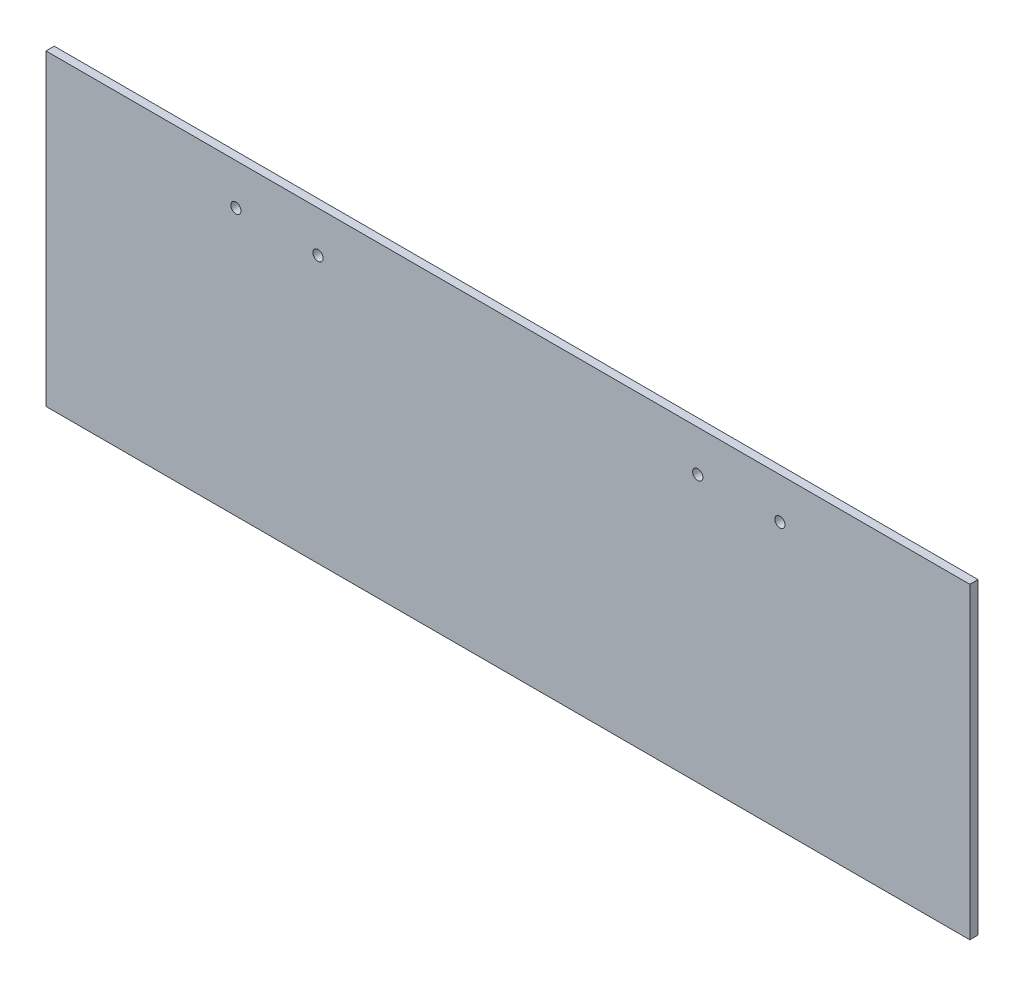
ISO-10303-21;
HEADER;
FILE_DESCRIPTION(('STEP AP214'),'2;1');
FILE_NAME('part.step','',(''),(''),'','','');
FILE_SCHEMA(('AUTOMOTIVE_DESIGN { 1 0 10303 214 1 1 1 1 }'));
ENDSEC;
DATA;
#1=APPLICATION_CONTEXT('core data for automotive mechanical design processes');
#2=APPLICATION_PROTOCOL_DEFINITION('international standard','automotive_design',2000,#1);
#3=PRODUCT_CONTEXT('',#1,'mechanical');
#4=PRODUCT('Part','Part','',(#3));
#5=PRODUCT_RELATED_PRODUCT_CATEGORY('part','',(#4));
#6=PRODUCT_DEFINITION_FORMATION('','',#4);
#7=PRODUCT_DEFINITION_CONTEXT('part definition',#1,'design');
#8=PRODUCT_DEFINITION('design','',#6,#7);
#9=PRODUCT_DEFINITION_SHAPE('','',#8);
#10=(LENGTH_UNIT() NAMED_UNIT(*) SI_UNIT(.MILLI.,.METRE.));
#11=(NAMED_UNIT(*) PLANE_ANGLE_UNIT() SI_UNIT($,.RADIAN.));
#12=(NAMED_UNIT(*) SI_UNIT($,.STERADIAN.) SOLID_ANGLE_UNIT());
#13=UNCERTAINTY_MEASURE_WITH_UNIT(LENGTH_MEASURE(1.E-05),#10,'distance_accuracy_value','');
#14=(GEOMETRIC_REPRESENTATION_CONTEXT(3) GLOBAL_UNCERTAINTY_ASSIGNED_CONTEXT((#13)) GLOBAL_UNIT_ASSIGNED_CONTEXT((#10,
#11,#12)) REPRESENTATION_CONTEXT('',''));
#15=CARTESIAN_POINT('',(0.,0.,0.));
#16=DIRECTION('',(0.,0.,1.));
#17=DIRECTION('',(1.,0.,0.));
#18=AXIS2_PLACEMENT_3D('',#15,#16,#17);
#19=CARTESIAN_POINT('',(-225.,150.,2.));
#20=DIRECTION('',(1.,0.,0.));
#21=DIRECTION('',(0.,1.,0.));
#22=AXIS2_PLACEMENT_3D('',#19,#20,#21);
#23=PLANE('',#22);
#24=DIRECTION('',(0.,-1.,0.));
#25=VECTOR('',#24,1.);
#26=CARTESIAN_POINT('',(-225.,150.,-2.));
#27=LINE('',#26,#25);
#28=CARTESIAN_POINT('',(-225.,150.,-2.));
#29=VERTEX_POINT('',#28);
#30=CARTESIAN_POINT('',(-225.,0.,-2.));
#31=VERTEX_POINT('',#30);
#32=EDGE_CURVE('E105',#29,#31,#27,.T.);
#33=ORIENTED_EDGE('',*,*,#32,.T.);
#34=DIRECTION('',(0.,0.,-1.));
#35=VECTOR('',#34,1.);
#36=CARTESIAN_POINT('',(-225.,0.,2.));
#37=LINE('',#36,#35);
#38=CARTESIAN_POINT('',(-225.,0.,2.));
#39=VERTEX_POINT('',#38);
#40=EDGE_CURVE('E11',#39,#31,#37,.T.);
#41=ORIENTED_EDGE('',*,*,#40,.F.);
#42=DIRECTION('',(0.,-1.,0.));
#43=VECTOR('',#42,1.);
#44=CARTESIAN_POINT('',(-225.,150.,2.));
#45=LINE('',#44,#43);
#46=CARTESIAN_POINT('',(-225.,150.,2.));
#47=VERTEX_POINT('',#46);
#48=EDGE_CURVE('E89',#47,#39,#45,.T.);
#49=ORIENTED_EDGE('',*,*,#48,.F.);
#50=DIRECTION('',(0.,0.,-1.));
#51=VECTOR('',#50,1.);
#52=CARTESIAN_POINT('',(-225.,150.,2.));
#53=LINE('',#52,#51);
#54=EDGE_CURVE('E98',#47,#29,#53,.T.);
#55=ORIENTED_EDGE('',*,*,#54,.T.);
#56=EDGE_LOOP('',(#33,#41,#49,#55));
#57=FACE_BOUND('',#56,.T.);
#58=ADVANCED_FACE('F39',(#57),#23,.F.);
#59=CARTESIAN_POINT('',(225.,0.,2.));
#60=DIRECTION('',(0.,1.,0.));
#61=DIRECTION('',(-1.,0.,0.));
#62=AXIS2_PLACEMENT_3D('',#59,#60,#61);
#63=PLANE('',#62);
#64=DIRECTION('',(1.,0.,0.));
#65=VECTOR('',#64,1.);
#66=CARTESIAN_POINT('',(225.,0.,-2.));
#67=LINE('',#66,#65);
#68=CARTESIAN_POINT('',(225.,0.,-2.));
#69=VERTEX_POINT('',#68);
#70=EDGE_CURVE('E94',#31,#69,#67,.T.);
#71=ORIENTED_EDGE('',*,*,#70,.T.);
#72=DIRECTION('',(0.,0.,-1.));
#73=VECTOR('',#72,1.);
#74=CARTESIAN_POINT('',(225.,0.,2.));
#75=LINE('',#74,#73);
#76=CARTESIAN_POINT('',(225.,0.,2.));
#77=VERTEX_POINT('',#76);
#78=EDGE_CURVE('E50',#77,#69,#75,.T.);
#79=ORIENTED_EDGE('',*,*,#78,.F.);
#80=DIRECTION('',(1.,0.,0.));
#81=VECTOR('',#80,1.);
#82=CARTESIAN_POINT('',(225.,0.,2.));
#83=LINE('',#82,#81);
#84=EDGE_CURVE('E83',#39,#77,#83,.T.);
#85=ORIENTED_EDGE('',*,*,#84,.F.);
#86=ORIENTED_EDGE('',*,*,#40,.T.);
#87=EDGE_LOOP('',(#71,#79,#85,#86));
#88=FACE_BOUND('',#87,.T.);
#89=ADVANCED_FACE('F91',(#88),#63,.F.);
#90=CARTESIAN_POINT('',(225.,150.,2.));
#91=DIRECTION('',(-1.,0.,0.));
#92=DIRECTION('',(0.,-1.,0.));
#93=AXIS2_PLACEMENT_3D('',#90,#91,#92);
#94=PLANE('',#93);
#95=DIRECTION('',(0.,1.,0.));
#96=VECTOR('',#95,1.);
#97=CARTESIAN_POINT('',(225.,150.,-2.));
#98=LINE('',#97,#96);
#99=CARTESIAN_POINT('',(225.,150.,-2.));
#100=VERTEX_POINT('',#99);
#101=EDGE_CURVE('E75',#69,#100,#98,.T.);
#102=ORIENTED_EDGE('',*,*,#101,.T.);
#103=DIRECTION('',(0.,0.,-1.));
#104=VECTOR('',#103,1.);
#105=CARTESIAN_POINT('',(225.,150.,2.));
#106=LINE('',#105,#104);
#107=CARTESIAN_POINT('',(225.,150.,2.));
#108=VERTEX_POINT('',#107);
#109=EDGE_CURVE('E92',#108,#100,#106,.T.);
#110=ORIENTED_EDGE('',*,*,#109,.F.);
#111=DIRECTION('',(0.,1.,0.));
#112=VECTOR('',#111,1.);
#113=CARTESIAN_POINT('',(225.,150.,2.));
#114=LINE('',#113,#112);
#115=EDGE_CURVE('E86',#77,#108,#114,.T.);
#116=ORIENTED_EDGE('',*,*,#115,.F.);
#117=ORIENTED_EDGE('',*,*,#78,.T.);
#118=EDGE_LOOP('',(#102,#110,#116,#117));
#119=FACE_BOUND('',#118,.T.);
#120=ADVANCED_FACE('F96',(#119),#94,.F.);
#121=CARTESIAN_POINT('',(225.,150.,2.));
#122=DIRECTION('',(0.,-1.,0.));
#123=DIRECTION('',(1.,0.,0.));
#124=AXIS2_PLACEMENT_3D('',#121,#122,#123);
#125=PLANE('',#124);
#126=DIRECTION('',(-1.,0.,0.));
#127=VECTOR('',#126,1.);
#128=CARTESIAN_POINT('',(225.,150.,-2.));
#129=LINE('',#128,#127);
#130=EDGE_CURVE('E79',#100,#29,#129,.T.);
#131=ORIENTED_EDGE('',*,*,#130,.T.);
#132=ORIENTED_EDGE('',*,*,#54,.F.);
#133=DIRECTION('',(-1.,0.,0.));
#134=VECTOR('',#133,1.);
#135=CARTESIAN_POINT('',(225.,150.,2.));
#136=LINE('',#135,#134);
#137=EDGE_CURVE('E54',#108,#47,#136,.T.);
#138=ORIENTED_EDGE('',*,*,#137,.F.);
#139=ORIENTED_EDGE('',*,*,#109,.T.);
#140=EDGE_LOOP('',(#131,#132,#138,#139));
#141=FACE_BOUND('',#140,.T.);
#142=ADVANCED_FACE('F109',(#141),#125,.F.);
#143=CARTESIAN_POINT('',(0.,0.,2.));
#144=DIRECTION('',(0.,0.,-1.));
#145=DIRECTION('',(-1.,0.,0.));
#146=AXIS2_PLACEMENT_3D('',#143,#144,#145);
#147=PLANE('',#146);
#148=CARTESIAN_POINT('',(-132.5,130.,2.));
#149=DIRECTION('',(0.,0.,1.));
#150=DIRECTION('',(1.,0.,0.));
#151=AXIS2_PLACEMENT_3D('',#148,#149,#150);
#152=CIRCLE('',#151,2.49999999999997);
#153=CARTESIAN_POINT('',(-130.,130.,2.));
#154=VERTEX_POINT('',#153);
#155=EDGE_CURVE('E137',#154,#154,#152,.T.);
#156=ORIENTED_EDGE('',*,*,#155,.F.);
#157=EDGE_LOOP('',(#156));
#158=FACE_BOUND('',#157,.T.);
#159=CARTESIAN_POINT('',(-92.5000000000001,130.,2.));
#160=DIRECTION('',(0.,0.,1.));
#161=DIRECTION('',(1.,0.,0.));
#162=AXIS2_PLACEMENT_3D('',#159,#160,#161);
#163=CIRCLE('',#162,2.49999999999999);
#164=CARTESIAN_POINT('',(-90.0000000000001,130.,2.));
#165=VERTEX_POINT('',#164);
#166=EDGE_CURVE('E128',#165,#165,#163,.T.);
#167=ORIENTED_EDGE('',*,*,#166,.F.);
#168=EDGE_LOOP('',(#167));
#169=FACE_BOUND('',#168,.T.);
#170=CARTESIAN_POINT('',(92.5000000000001,130.,2.));
#171=DIRECTION('',(0.,0.,1.));
#172=DIRECTION('',(1.,0.,0.));
#173=AXIS2_PLACEMENT_3D('',#170,#171,#172);
#174=CIRCLE('',#173,2.49999999999999);
#175=CARTESIAN_POINT('',(95.0000000000001,130.,2.));
#176=VERTEX_POINT('',#175);
#177=EDGE_CURVE('E121',#176,#176,#174,.T.);
#178=ORIENTED_EDGE('',*,*,#177,.F.);
#179=EDGE_LOOP('',(#178));
#180=FACE_BOUND('',#179,.T.);
#181=CARTESIAN_POINT('',(132.5,130.,2.));
#182=DIRECTION('',(0.,0.,1.));
#183=DIRECTION('',(1.,0.,0.));
#184=AXIS2_PLACEMENT_3D('',#181,#182,#183);
#185=CIRCLE('',#184,2.49999999999997);
#186=CARTESIAN_POINT('',(135.,130.,2.));
#187=VERTEX_POINT('',#186);
#188=EDGE_CURVE('E119',#187,#187,#185,.T.);
#189=ORIENTED_EDGE('',*,*,#188,.F.);
#190=EDGE_LOOP('',(#189));
#191=FACE_BOUND('',#190,.T.);
#192=ORIENTED_EDGE('',*,*,#48,.T.);
#193=ORIENTED_EDGE('',*,*,#84,.T.);
#194=ORIENTED_EDGE('',*,*,#115,.T.);
#195=ORIENTED_EDGE('',*,*,#137,.T.);
#196=EDGE_LOOP('',(#192,#193,#194,#195));
#197=FACE_BOUND('',#196,.T.);
#198=ADVANCED_FACE('F88',(#158,#169,#180,#191,#197),#147,.F.);
#199=CARTESIAN_POINT('',(0.,0.,-2.));
#200=DIRECTION('',(0.,0.,-1.));
#201=DIRECTION('',(-1.,0.,0.));
#202=AXIS2_PLACEMENT_3D('',#199,#200,#201);
#203=PLANE('',#202);
#204=CARTESIAN_POINT('',(-132.5,130.,-2.));
#205=DIRECTION('',(0.,0.,1.));
#206=DIRECTION('',(1.,0.,0.));
#207=AXIS2_PLACEMENT_3D('',#204,#205,#206);
#208=CIRCLE('',#207,2.5);
#209=CARTESIAN_POINT('',(-130.,130.,-2.));
#210=VERTEX_POINT('',#209);
#211=EDGE_CURVE('E134',#210,#210,#208,.T.);
#212=ORIENTED_EDGE('',*,*,#211,.T.);
#213=EDGE_LOOP('',(#212));
#214=FACE_BOUND('',#213,.T.);
#215=CARTESIAN_POINT('',(-92.5000000000001,130.,-2.));
#216=DIRECTION('',(0.,0.,1.));
#217=DIRECTION('',(1.,0.,0.));
#218=AXIS2_PLACEMENT_3D('',#215,#216,#217);
#219=CIRCLE('',#218,2.5);
#220=CARTESIAN_POINT('',(-90.0000000000001,130.,-2.));
#221=VERTEX_POINT('',#220);
#222=EDGE_CURVE('E130',#221,#221,#219,.T.);
#223=ORIENTED_EDGE('',*,*,#222,.T.);
#224=EDGE_LOOP('',(#223));
#225=FACE_BOUND('',#224,.T.);
#226=CARTESIAN_POINT('',(92.5000000000001,130.,-2.));
#227=DIRECTION('',(0.,0.,1.));
#228=DIRECTION('',(1.,0.,0.));
#229=AXIS2_PLACEMENT_3D('',#226,#227,#228);
#230=CIRCLE('',#229,2.5);
#231=CARTESIAN_POINT('',(95.0000000000001,130.,-2.));
#232=VERTEX_POINT('',#231);
#233=EDGE_CURVE('E122',#232,#232,#230,.T.);
#234=ORIENTED_EDGE('',*,*,#233,.T.);
#235=EDGE_LOOP('',(#234));
#236=FACE_BOUND('',#235,.T.);
#237=CARTESIAN_POINT('',(132.5,130.,-2.));
#238=DIRECTION('',(0.,0.,1.));
#239=DIRECTION('',(1.,0.,0.));
#240=AXIS2_PLACEMENT_3D('',#237,#238,#239);
#241=CIRCLE('',#240,2.5);
#242=CARTESIAN_POINT('',(135.,130.,-2.));
#243=VERTEX_POINT('',#242);
#244=EDGE_CURVE('E104',#243,#243,#241,.T.);
#245=ORIENTED_EDGE('',*,*,#244,.T.);
#246=EDGE_LOOP('',(#245));
#247=FACE_BOUND('',#246,.T.);
#248=ORIENTED_EDGE('',*,*,#32,.F.);
#249=ORIENTED_EDGE('',*,*,#130,.F.);
#250=ORIENTED_EDGE('',*,*,#101,.F.);
#251=ORIENTED_EDGE('',*,*,#70,.F.);
#252=EDGE_LOOP('',(#248,#249,#250,#251));
#253=FACE_BOUND('',#252,.T.);
#254=ADVANCED_FACE('F114',(#214,#225,#236,#247,#253),#203,.T.);
#255=CARTESIAN_POINT('',(132.5,130.,2.));
#256=DIRECTION('',(0.,0.,1.));
#257=DIRECTION('',(1.,0.,0.));
#258=AXIS2_PLACEMENT_3D('',#255,#256,#257);
#259=CYLINDRICAL_SURFACE('',#258,2.49999999999999);
#260=ORIENTED_EDGE('',*,*,#244,.F.);
#261=EDGE_LOOP('',(#260));
#262=FACE_BOUND('',#261,.T.);
#263=ORIENTED_EDGE('',*,*,#188,.T.);
#264=EDGE_LOOP('',(#263));
#265=FACE_BOUND('',#264,.T.);
#266=ADVANCED_FACE('F151',(#262,#265),#259,.F.);
#267=CARTESIAN_POINT('',(92.5000000000001,130.,2.));
#268=DIRECTION('',(0.,0.,1.));
#269=DIRECTION('',(1.,0.,0.));
#270=AXIS2_PLACEMENT_3D('',#267,#268,#269);
#271=CYLINDRICAL_SURFACE('',#270,2.5);
#272=ORIENTED_EDGE('',*,*,#233,.F.);
#273=EDGE_LOOP('',(#272));
#274=FACE_BOUND('',#273,.T.);
#275=ORIENTED_EDGE('',*,*,#177,.T.);
#276=EDGE_LOOP('',(#275));
#277=FACE_BOUND('',#276,.T.);
#278=ADVANCED_FACE('F153',(#274,#277),#271,.F.);
#279=CARTESIAN_POINT('',(-92.5000000000001,130.,2.));
#280=DIRECTION('',(0.,0.,1.));
#281=DIRECTION('',(1.,0.,0.));
#282=AXIS2_PLACEMENT_3D('',#279,#280,#281);
#283=CYLINDRICAL_SURFACE('',#282,2.5);
#284=ORIENTED_EDGE('',*,*,#222,.F.);
#285=EDGE_LOOP('',(#284));
#286=FACE_BOUND('',#285,.T.);
#287=ORIENTED_EDGE('',*,*,#166,.T.);
#288=EDGE_LOOP('',(#287));
#289=FACE_BOUND('',#288,.T.);
#290=ADVANCED_FACE('F159',(#286,#289),#283,.F.);
#291=CARTESIAN_POINT('',(-132.5,130.,2.));
#292=DIRECTION('',(0.,0.,1.));
#293=DIRECTION('',(1.,0.,0.));
#294=AXIS2_PLACEMENT_3D('',#291,#292,#293);
#295=CYLINDRICAL_SURFACE('',#294,2.49999999999999);
#296=ORIENTED_EDGE('',*,*,#211,.F.);
#297=EDGE_LOOP('',(#296));
#298=FACE_BOUND('',#297,.T.);
#299=ORIENTED_EDGE('',*,*,#155,.T.);
#300=EDGE_LOOP('',(#299));
#301=FACE_BOUND('',#300,.T.);
#302=ADVANCED_FACE('F138',(#298,#301),#295,.F.);
#303=CLOSED_SHELL('',(#58,#89,#120,#142,#198,#254,#266,#278,#290,#302));
#304=MANIFOLD_SOLID_BREP('B2',#303);
#305=ADVANCED_BREP_SHAPE_REPRESENTATION('',(#18,#304),#14);
#306=SHAPE_DEFINITION_REPRESENTATION(#9,#305);
ENDSEC;
END-ISO-10303-21;
